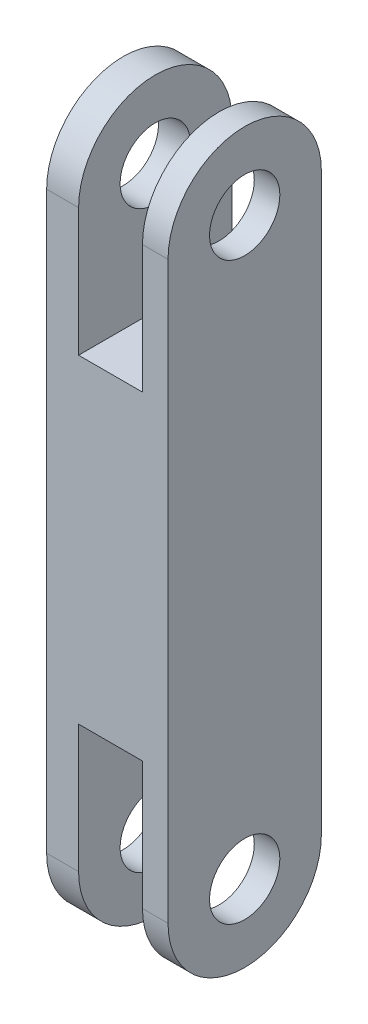
ISO-10303-21;
HEADER;
FILE_DESCRIPTION(('STEP AP214'),'2;1');
FILE_NAME('part.step','',(''),(''),'','','');
FILE_SCHEMA(('AUTOMOTIVE_DESIGN { 1 0 10303 214 1 1 1 1 }'));
ENDSEC;
DATA;
#1=APPLICATION_CONTEXT('core data for automotive mechanical design processes');
#2=APPLICATION_PROTOCOL_DEFINITION('international standard','automotive_design',2000,#1);
#3=PRODUCT_CONTEXT('',#1,'mechanical');
#4=PRODUCT('Part','Part','',(#3));
#5=PRODUCT_RELATED_PRODUCT_CATEGORY('part','',(#4));
#6=PRODUCT_DEFINITION_FORMATION('','',#4);
#7=PRODUCT_DEFINITION_CONTEXT('part definition',#1,'design');
#8=PRODUCT_DEFINITION('design','',#6,#7);
#9=PRODUCT_DEFINITION_SHAPE('','',#8);
#10=(LENGTH_UNIT() NAMED_UNIT(*) SI_UNIT(.MILLI.,.METRE.));
#11=(NAMED_UNIT(*) PLANE_ANGLE_UNIT() SI_UNIT($,.RADIAN.));
#12=(NAMED_UNIT(*) SI_UNIT($,.STERADIAN.) SOLID_ANGLE_UNIT());
#13=UNCERTAINTY_MEASURE_WITH_UNIT(LENGTH_MEASURE(1.E-05),#10,'distance_accuracy_value','');
#14=(GEOMETRIC_REPRESENTATION_CONTEXT(3) GLOBAL_UNCERTAINTY_ASSIGNED_CONTEXT((#13)) GLOBAL_UNIT_ASSIGNED_CONTEXT((#10,
#11,#12)) REPRESENTATION_CONTEXT('',''));
#15=CARTESIAN_POINT('',(0.,0.,0.));
#16=DIRECTION('',(0.,0.,1.));
#17=DIRECTION('',(1.,0.,0.));
#18=AXIS2_PLACEMENT_3D('',#15,#16,#17);
#19=CARTESIAN_POINT('',(0.,0.,0.));
#20=DIRECTION('',(1.,0.,0.));
#21=DIRECTION('',(0.,0.,-1.));
#22=AXIS2_PLACEMENT_3D('',#19,#20,#21);
#23=PLANE('',#22);
#24=CARTESIAN_POINT('',(0.,45.,0.));
#25=DIRECTION('',(1.,0.,0.));
#26=DIRECTION('',(0.,0.,-1.));
#27=AXIS2_PLACEMENT_3D('',#24,#25,#26);
#28=CIRCLE('',#27,2.75000000000001);
#29=CARTESIAN_POINT('',(0.,45.,-2.75000000000001));
#30=VERTEX_POINT('',#29);
#31=EDGE_CURVE('E181',#30,#30,#28,.T.);
#32=ORIENTED_EDGE('',*,*,#31,.T.);
#33=EDGE_LOOP('',(#32));
#34=FACE_BOUND('',#33,.T.);
#35=DIRECTION('',(0.,0.,-1.));
#36=VECTOR('',#35,1.);
#37=CARTESIAN_POINT('',(0.,35.,6.));
#38=LINE('',#37,#36);
#39=CARTESIAN_POINT('',(0.,35.,6.));
#40=VERTEX_POINT('',#39);
#41=CARTESIAN_POINT('',(0.,35.,-6.));
#42=VERTEX_POINT('',#41);
#43=EDGE_CURVE('E155',#40,#42,#38,.T.);
#44=ORIENTED_EDGE('',*,*,#43,.F.);
#45=DIRECTION('',(0.,-1.,0.));
#46=VECTOR('',#45,1.);
#47=CARTESIAN_POINT('',(0.,0.,6.));
#48=LINE('',#47,#46);
#49=CARTESIAN_POINT('',(0.,45.,6.));
#50=VERTEX_POINT('',#49);
#51=EDGE_CURVE('E198',#50,#40,#48,.T.);
#52=ORIENTED_EDGE('',*,*,#51,.F.);
#53=CARTESIAN_POINT('',(0.,45.,0.));
#54=DIRECTION('',(1.,0.,0.));
#55=DIRECTION('',(0.,0.,-1.));
#56=AXIS2_PLACEMENT_3D('',#53,#54,#55);
#57=CIRCLE('',#56,6.);
#58=CARTESIAN_POINT('',(0.,45.,-6.));
#59=VERTEX_POINT('',#58);
#60=EDGE_CURVE('E209',#59,#50,#57,.T.);
#61=ORIENTED_EDGE('',*,*,#60,.F.);
#62=DIRECTION('',(0.,1.,0.));
#63=VECTOR('',#62,1.);
#64=CARTESIAN_POINT('',(0.,0.,-6.));
#65=LINE('',#64,#63);
#66=EDGE_CURVE('E54',#42,#59,#65,.T.);
#67=ORIENTED_EDGE('',*,*,#66,.F.);
#68=EDGE_LOOP('',(#44,#52,#61,#67));
#69=FACE_BOUND('',#68,.T.);
#70=ADVANCED_FACE('F39',(#34,#69),#23,.F.);
#71=CARTESIAN_POINT('',(0.,0.,0.));
#72=DIRECTION('',(1.,0.,0.));
#73=DIRECTION('',(0.,0.,-1.));
#74=AXIS2_PLACEMENT_3D('',#71,#72,#73);
#75=CIRCLE('',#74,2.75);
#76=CARTESIAN_POINT('',(0.,0.,-2.75));
#77=VERTEX_POINT('',#76);
#78=EDGE_CURVE('E185',#77,#77,#75,.T.);
#79=ORIENTED_EDGE('',*,*,#78,.T.);
#80=EDGE_LOOP('',(#79));
#81=FACE_BOUND('',#80,.T.);
#82=DIRECTION('',(0.,0.,1.));
#83=VECTOR('',#82,1.);
#84=CARTESIAN_POINT('',(0.,10.,6.));
#85=LINE('',#84,#83);
#86=CARTESIAN_POINT('',(0.,10.,-6.));
#87=VERTEX_POINT('',#86);
#88=CARTESIAN_POINT('',(0.,10.,6.));
#89=VERTEX_POINT('',#88);
#90=EDGE_CURVE('E62',#87,#89,#85,.T.);
#91=ORIENTED_EDGE('',*,*,#90,.F.);
#92=CARTESIAN_POINT('',(0.,0.,-6.));
#93=VERTEX_POINT('',#92);
#94=EDGE_CURVE('E207',#93,#87,#65,.T.);
#95=ORIENTED_EDGE('',*,*,#94,.F.);
#96=CARTESIAN_POINT('',(0.,0.,0.));
#97=DIRECTION('',(1.,0.,0.));
#98=DIRECTION('',(0.,0.,-1.));
#99=AXIS2_PLACEMENT_3D('',#96,#97,#98);
#100=CIRCLE('',#99,6.);
#101=CARTESIAN_POINT('',(0.,0.,6.));
#102=VERTEX_POINT('',#101);
#103=EDGE_CURVE('E191',#102,#93,#100,.T.);
#104=ORIENTED_EDGE('',*,*,#103,.F.);
#105=EDGE_CURVE('E211',#89,#102,#48,.T.);
#106=ORIENTED_EDGE('',*,*,#105,.F.);
#107=EDGE_LOOP('',(#91,#95,#104,#106));
#108=FACE_BOUND('',#107,.T.);
#109=ADVANCED_FACE('F260',(#81,#108),#23,.F.);
#110=CARTESIAN_POINT('',(2.,0.,0.));
#111=DIRECTION('',(1.,0.,0.));
#112=DIRECTION('',(0.,0.,-1.));
#113=AXIS2_PLACEMENT_3D('',#110,#111,#112);
#114=PLANE('',#113);
#115=CARTESIAN_POINT('',(2.,0.,0.));
#116=DIRECTION('',(1.,0.,0.));
#117=DIRECTION('',(0.,0.,-1.));
#118=AXIS2_PLACEMENT_3D('',#115,#116,#117);
#119=CIRCLE('',#118,2.75);
#120=CARTESIAN_POINT('',(2.,0.,-2.75));
#121=VERTEX_POINT('',#120);
#122=EDGE_CURVE('E188',#121,#121,#119,.T.);
#123=ORIENTED_EDGE('',*,*,#122,.F.);
#124=EDGE_LOOP('',(#123));
#125=FACE_BOUND('',#124,.T.);
#126=CARTESIAN_POINT('',(2.,0.,0.));
#127=DIRECTION('',(1.,0.,0.));
#128=DIRECTION('',(0.,0.,-1.));
#129=AXIS2_PLACEMENT_3D('',#126,#127,#128);
#130=CIRCLE('',#129,6.);
#131=CARTESIAN_POINT('',(2.,0.,6.));
#132=VERTEX_POINT('',#131);
#133=CARTESIAN_POINT('',(2.,0.,-6.));
#134=VERTEX_POINT('',#133);
#135=EDGE_CURVE('E194',#132,#134,#130,.T.);
#136=ORIENTED_EDGE('',*,*,#135,.T.);
#137=DIRECTION('',(0.,1.,0.));
#138=VECTOR('',#137,1.);
#139=CARTESIAN_POINT('',(2.,0.,-6.));
#140=LINE('',#139,#138);
#141=CARTESIAN_POINT('',(2.,45.,-6.));
#142=VERTEX_POINT('',#141);
#143=EDGE_CURVE('E197',#134,#142,#140,.T.);
#144=ORIENTED_EDGE('',*,*,#143,.T.);
#145=CARTESIAN_POINT('',(2.,45.,0.));
#146=DIRECTION('',(1.,0.,0.));
#147=DIRECTION('',(0.,0.,-1.));
#148=AXIS2_PLACEMENT_3D('',#145,#146,#147);
#149=CIRCLE('',#148,6.);
#150=CARTESIAN_POINT('',(2.,45.,6.));
#151=VERTEX_POINT('',#150);
#152=EDGE_CURVE('E200',#142,#151,#149,.T.);
#153=ORIENTED_EDGE('',*,*,#152,.T.);
#154=DIRECTION('',(0.,-1.,0.));
#155=VECTOR('',#154,1.);
#156=CARTESIAN_POINT('',(2.,0.,6.));
#157=LINE('',#156,#155);
#158=EDGE_CURVE('E202',#151,#132,#157,.T.);
#159=ORIENTED_EDGE('',*,*,#158,.T.);
#160=EDGE_LOOP('',(#136,#144,#153,#159));
#161=FACE_BOUND('',#160,.T.);
#162=CARTESIAN_POINT('',(2.,45.,0.));
#163=DIRECTION('',(1.,0.,0.));
#164=DIRECTION('',(0.,0.,-1.));
#165=AXIS2_PLACEMENT_3D('',#162,#163,#164);
#166=CIRCLE('',#165,2.75000000000001);
#167=CARTESIAN_POINT('',(2.,45.,-2.75000000000001));
#168=VERTEX_POINT('',#167);
#169=EDGE_CURVE('E182',#168,#168,#166,.T.);
#170=ORIENTED_EDGE('',*,*,#169,.F.);
#171=EDGE_LOOP('',(#170));
#172=FACE_BOUND('',#171,.T.);
#173=ADVANCED_FACE('F262',(#125,#161,#172),#114,.T.);
#174=CARTESIAN_POINT('',(2.,0.,0.));
#175=DIRECTION('',(-1.,0.,0.));
#176=DIRECTION('',(0.,0.,1.));
#177=AXIS2_PLACEMENT_3D('',#174,#175,#176);
#178=CYLINDRICAL_SURFACE('',#177,6.);
#179=ORIENTED_EDGE('',*,*,#103,.T.);
#180=DIRECTION('',(-1.,0.,0.));
#181=VECTOR('',#180,1.);
#182=CARTESIAN_POINT('',(2.,0.,-6.));
#183=LINE('',#182,#181);
#184=EDGE_CURVE('E11',#134,#93,#183,.T.);
#185=ORIENTED_EDGE('',*,*,#184,.F.);
#186=ORIENTED_EDGE('',*,*,#135,.F.);
#187=DIRECTION('',(-1.,0.,0.));
#188=VECTOR('',#187,1.);
#189=CARTESIAN_POINT('',(2.,0.,6.));
#190=LINE('',#189,#188);
#191=EDGE_CURVE('E204',#132,#102,#190,.T.);
#192=ORIENTED_EDGE('',*,*,#191,.T.);
#193=EDGE_LOOP('',(#179,#185,#186,#192));
#194=FACE_BOUND('',#193,.T.);
#195=ADVANCED_FACE('F41',(#194),#178,.T.);
#196=CARTESIAN_POINT('',(2.,0.,-6.));
#197=DIRECTION('',(0.,0.,1.));
#198=DIRECTION('',(0.,-1.,0.));
#199=AXIS2_PLACEMENT_3D('',#196,#197,#198);
#200=PLANE('',#199);
#201=ORIENTED_EDGE('',*,*,#94,.T.);
#202=DIRECTION('',(1.,0.,0.));
#203=VECTOR('',#202,1.);
#204=CARTESIAN_POINT('',(-5.,10.,-6.));
#205=LINE('',#204,#203);
#206=CARTESIAN_POINT('',(-5.,10.,-6.));
#207=VERTEX_POINT('',#206);
#208=EDGE_CURVE('E176',#207,#87,#205,.T.);
#209=ORIENTED_EDGE('',*,*,#208,.F.);
#210=DIRECTION('',(0.,-1.,0.));
#211=VECTOR('',#210,1.);
#212=CARTESIAN_POINT('',(-5.,45.,-6.));
#213=LINE('',#212,#211);
#214=CARTESIAN_POINT('',(-5.,0.,-6.));
#215=VERTEX_POINT('',#214);
#216=EDGE_CURVE('E252',#207,#215,#213,.T.);
#217=ORIENTED_EDGE('',*,*,#216,.T.);
#218=DIRECTION('',(1.,0.,0.));
#219=VECTOR('',#218,1.);
#220=CARTESIAN_POINT('',(-7.5,0.,-6.));
#221=LINE('',#220,#219);
#222=CARTESIAN_POINT('',(-7.5,0.,-6.));
#223=VERTEX_POINT('',#222);
#224=EDGE_CURVE('E136',#223,#215,#221,.T.);
#225=ORIENTED_EDGE('',*,*,#224,.F.);
#226=DIRECTION('',(0.,-1.,0.));
#227=VECTOR('',#226,1.);
#228=CARTESIAN_POINT('',(-7.5,45.,-6.));
#229=LINE('',#228,#227);
#230=CARTESIAN_POINT('',(-7.5,45.,-6.));
#231=VERTEX_POINT('',#230);
#232=EDGE_CURVE('E128',#231,#223,#229,.T.);
#233=ORIENTED_EDGE('',*,*,#232,.F.);
#234=DIRECTION('',(1.,0.,0.));
#235=VECTOR('',#234,1.);
#236=CARTESIAN_POINT('',(-7.5,45.,-6.));
#237=LINE('',#236,#235);
#238=CARTESIAN_POINT('',(-5.,45.,-6.));
#239=VERTEX_POINT('',#238);
#240=EDGE_CURVE('E133',#231,#239,#237,.T.);
#241=ORIENTED_EDGE('',*,*,#240,.T.);
#242=CARTESIAN_POINT('',(-5.,35.,-6.));
#243=VERTEX_POINT('',#242);
#244=EDGE_CURVE('E238',#239,#243,#213,.T.);
#245=ORIENTED_EDGE('',*,*,#244,.T.);
#246=DIRECTION('',(1.,0.,0.));
#247=VECTOR('',#246,1.);
#248=CARTESIAN_POINT('',(-5.,35.,-6.));
#249=LINE('',#248,#247);
#250=EDGE_CURVE('E179',#243,#42,#249,.T.);
#251=ORIENTED_EDGE('',*,*,#250,.T.);
#252=ORIENTED_EDGE('',*,*,#66,.T.);
#253=DIRECTION('',(-1.,0.,0.));
#254=VECTOR('',#253,1.);
#255=CARTESIAN_POINT('',(2.,45.,-6.));
#256=LINE('',#255,#254);
#257=EDGE_CURVE('E47',#142,#59,#256,.T.);
#258=ORIENTED_EDGE('',*,*,#257,.F.);
#259=ORIENTED_EDGE('',*,*,#143,.F.);
#260=ORIENTED_EDGE('',*,*,#184,.T.);
#261=EDGE_LOOP('',(#201,#209,#217,#225,#233,#241,#245,#251,#252,#258,#259,#260));
#262=FACE_BOUND('',#261,.T.);
#263=ADVANCED_FACE('F130',(#262),#200,.F.);
#264=CARTESIAN_POINT('',(2.,45.,0.));
#265=DIRECTION('',(-1.,0.,0.));
#266=DIRECTION('',(0.,0.,1.));
#267=AXIS2_PLACEMENT_3D('',#264,#265,#266);
#268=CYLINDRICAL_SURFACE('',#267,6.);
#269=ORIENTED_EDGE('',*,*,#60,.T.);
#270=DIRECTION('',(-1.,0.,0.));
#271=VECTOR('',#270,1.);
#272=CARTESIAN_POINT('',(2.,45.,6.));
#273=LINE('',#272,#271);
#274=EDGE_CURVE('E216',#151,#50,#273,.T.);
#275=ORIENTED_EDGE('',*,*,#274,.F.);
#276=ORIENTED_EDGE('',*,*,#152,.F.);
#277=ORIENTED_EDGE('',*,*,#257,.T.);
#278=EDGE_LOOP('',(#269,#275,#276,#277));
#279=FACE_BOUND('',#278,.T.);
#280=ADVANCED_FACE('F222',(#279),#268,.T.);
#281=CARTESIAN_POINT('',(2.,0.,6.));
#282=DIRECTION('',(0.,0.,-1.));
#283=DIRECTION('',(0.,1.,0.));
#284=AXIS2_PLACEMENT_3D('',#281,#282,#283);
#285=PLANE('',#284);
#286=ORIENTED_EDGE('',*,*,#51,.T.);
#287=DIRECTION('',(1.,0.,0.));
#288=VECTOR('',#287,1.);
#289=CARTESIAN_POINT('',(-5.,35.,6.));
#290=LINE('',#289,#288);
#291=CARTESIAN_POINT('',(-5.,35.,6.));
#292=VERTEX_POINT('',#291);
#293=EDGE_CURVE('E168',#292,#40,#290,.T.);
#294=ORIENTED_EDGE('',*,*,#293,.F.);
#295=DIRECTION('',(0.,1.,0.));
#296=VECTOR('',#295,1.);
#297=CARTESIAN_POINT('',(-5.,45.,6.));
#298=LINE('',#297,#296);
#299=CARTESIAN_POINT('',(-5.,45.,6.));
#300=VERTEX_POINT('',#299);
#301=EDGE_CURVE('E233',#292,#300,#298,.T.);
#302=ORIENTED_EDGE('',*,*,#301,.T.);
#303=DIRECTION('',(1.,0.,0.));
#304=VECTOR('',#303,1.);
#305=CARTESIAN_POINT('',(-7.5,45.,6.));
#306=LINE('',#305,#304);
#307=CARTESIAN_POINT('',(-7.5,45.,6.));
#308=VERTEX_POINT('',#307);
#309=EDGE_CURVE('E242',#308,#300,#306,.T.);
#310=ORIENTED_EDGE('',*,*,#309,.F.);
#311=DIRECTION('',(0.,1.,0.));
#312=VECTOR('',#311,1.);
#313=CARTESIAN_POINT('',(-7.5,45.,6.));
#314=LINE('',#313,#312);
#315=CARTESIAN_POINT('',(-7.5,0.,6.));
#316=VERTEX_POINT('',#315);
#317=EDGE_CURVE('E146',#316,#308,#314,.T.);
#318=ORIENTED_EDGE('',*,*,#317,.F.);
#319=DIRECTION('',(1.,0.,0.));
#320=VECTOR('',#319,1.);
#321=CARTESIAN_POINT('',(-7.5,0.,6.));
#322=LINE('',#321,#320);
#323=CARTESIAN_POINT('',(-5.,0.,6.));
#324=VERTEX_POINT('',#323);
#325=EDGE_CURVE('E159',#316,#324,#322,.T.);
#326=ORIENTED_EDGE('',*,*,#325,.T.);
#327=CARTESIAN_POINT('',(-5.,10.,6.));
#328=VERTEX_POINT('',#327);
#329=EDGE_CURVE('E150',#324,#328,#298,.T.);
#330=ORIENTED_EDGE('',*,*,#329,.T.);
#331=DIRECTION('',(1.,0.,0.));
#332=VECTOR('',#331,1.);
#333=CARTESIAN_POINT('',(-5.,10.,6.));
#334=LINE('',#333,#332);
#335=EDGE_CURVE('E173',#328,#89,#334,.T.);
#336=ORIENTED_EDGE('',*,*,#335,.T.);
#337=ORIENTED_EDGE('',*,*,#105,.T.);
#338=ORIENTED_EDGE('',*,*,#191,.F.);
#339=ORIENTED_EDGE('',*,*,#158,.F.);
#340=ORIENTED_EDGE('',*,*,#274,.T.);
#341=EDGE_LOOP('',(#286,#294,#302,#310,#318,#326,#330,#336,#337,#338,#339,#340));
#342=FACE_BOUND('',#341,.T.);
#343=ADVANCED_FACE('F226',(#342),#285,.F.);
#344=CARTESIAN_POINT('',(2.,0.,0.));
#345=DIRECTION('',(-1.,0.,0.));
#346=DIRECTION('',(0.,0.,1.));
#347=AXIS2_PLACEMENT_3D('',#344,#345,#346);
#348=CYLINDRICAL_SURFACE('',#347,2.75);
#349=ORIENTED_EDGE('',*,*,#122,.T.);
#350=EDGE_LOOP('',(#349));
#351=FACE_BOUND('',#350,.T.);
#352=ORIENTED_EDGE('',*,*,#78,.F.);
#353=EDGE_LOOP('',(#352));
#354=FACE_BOUND('',#353,.T.);
#355=ADVANCED_FACE('F272',(#351,#354),#348,.F.);
#356=CARTESIAN_POINT('',(2.,45.,0.));
#357=DIRECTION('',(-1.,0.,0.));
#358=DIRECTION('',(0.,0.,1.));
#359=AXIS2_PLACEMENT_3D('',#356,#357,#358);
#360=CYLINDRICAL_SURFACE('',#359,2.75000000000001);
#361=ORIENTED_EDGE('',*,*,#169,.T.);
#362=EDGE_LOOP('',(#361));
#363=FACE_BOUND('',#362,.T.);
#364=ORIENTED_EDGE('',*,*,#31,.F.);
#365=EDGE_LOOP('',(#364));
#366=FACE_BOUND('',#365,.T.);
#367=ADVANCED_FACE('F269',(#363,#366),#360,.F.);
#368=CARTESIAN_POINT('',(-5.,35.,6.));
#369=DIRECTION('',(0.,-1.,0.));
#370=DIRECTION('',(0.,0.,-1.));
#371=AXIS2_PLACEMENT_3D('',#368,#369,#370);
#372=PLANE('',#371);
#373=ORIENTED_EDGE('',*,*,#43,.T.);
#374=ORIENTED_EDGE('',*,*,#250,.F.);
#375=DIRECTION('',(0.,0.,-1.));
#376=VECTOR('',#375,1.);
#377=CARTESIAN_POINT('',(-5.,35.,6.));
#378=LINE('',#377,#376);
#379=EDGE_CURVE('E163',#292,#243,#378,.T.);
#380=ORIENTED_EDGE('',*,*,#379,.F.);
#381=ORIENTED_EDGE('',*,*,#293,.T.);
#382=EDGE_LOOP('',(#373,#374,#380,#381));
#383=FACE_BOUND('',#382,.T.);
#384=ADVANCED_FACE('F230',(#383),#372,.F.);
#385=CARTESIAN_POINT('',(-5.,10.,6.));
#386=DIRECTION('',(0.,1.,0.));
#387=DIRECTION('',(0.,0.,1.));
#388=AXIS2_PLACEMENT_3D('',#385,#386,#387);
#389=PLANE('',#388);
#390=ORIENTED_EDGE('',*,*,#90,.T.);
#391=ORIENTED_EDGE('',*,*,#335,.F.);
#392=DIRECTION('',(0.,0.,1.));
#393=VECTOR('',#392,1.);
#394=CARTESIAN_POINT('',(-5.,10.,6.));
#395=LINE('',#394,#393);
#396=EDGE_CURVE('E166',#207,#328,#395,.T.);
#397=ORIENTED_EDGE('',*,*,#396,.F.);
#398=ORIENTED_EDGE('',*,*,#208,.T.);
#399=EDGE_LOOP('',(#390,#391,#397,#398));
#400=FACE_BOUND('',#399,.T.);
#401=ADVANCED_FACE('F254',(#400),#389,.F.);
#402=CARTESIAN_POINT('',(-5.,45.,0.));
#403=DIRECTION('',(-1.,0.,0.));
#404=DIRECTION('',(0.,0.,1.));
#405=AXIS2_PLACEMENT_3D('',#402,#403,#404);
#406=PLANE('',#405);
#407=CARTESIAN_POINT('',(-5.,45.,0.));
#408=DIRECTION('',(-1.,0.,0.));
#409=DIRECTION('',(0.,0.,1.));
#410=AXIS2_PLACEMENT_3D('',#407,#408,#409);
#411=CIRCLE('',#410,2.75000000000001);
#412=CARTESIAN_POINT('',(-5.,45.,2.75000000000001));
#413=VERTEX_POINT('',#412);
#414=EDGE_CURVE('E431',#413,#413,#411,.T.);
#415=ORIENTED_EDGE('',*,*,#414,.T.);
#416=EDGE_LOOP('',(#415));
#417=FACE_BOUND('',#416,.T.);
#418=ORIENTED_EDGE('',*,*,#301,.F.);
#419=ORIENTED_EDGE('',*,*,#379,.T.);
#420=ORIENTED_EDGE('',*,*,#244,.F.);
#421=CARTESIAN_POINT('',(-5.,45.,0.));
#422=DIRECTION('',(-1.,0.,0.));
#423=DIRECTION('',(0.,0.,1.));
#424=AXIS2_PLACEMENT_3D('',#421,#422,#423);
#425=CIRCLE('',#424,6.);
#426=EDGE_CURVE('E154',#300,#239,#425,.T.);
#427=ORIENTED_EDGE('',*,*,#426,.F.);
#428=EDGE_LOOP('',(#418,#419,#420,#427));
#429=FACE_BOUND('',#428,.T.);
#430=ADVANCED_FACE('F234',(#417,#429),#406,.F.);
#431=CARTESIAN_POINT('',(-5.,0.,0.));
#432=DIRECTION('',(-1.,0.,0.));
#433=DIRECTION('',(0.,0.,1.));
#434=AXIS2_PLACEMENT_3D('',#431,#432,#433);
#435=CIRCLE('',#434,2.75);
#436=CARTESIAN_POINT('',(-5.,0.,2.75));
#437=VERTEX_POINT('',#436);
#438=EDGE_CURVE('E429',#437,#437,#435,.T.);
#439=ORIENTED_EDGE('',*,*,#438,.T.);
#440=EDGE_LOOP('',(#439));
#441=FACE_BOUND('',#440,.T.);
#442=ORIENTED_EDGE('',*,*,#216,.F.);
#443=ORIENTED_EDGE('',*,*,#396,.T.);
#444=ORIENTED_EDGE('',*,*,#329,.F.);
#445=CARTESIAN_POINT('',(-5.,0.,0.));
#446=DIRECTION('',(-1.,0.,0.));
#447=DIRECTION('',(0.,0.,1.));
#448=AXIS2_PLACEMENT_3D('',#445,#446,#447);
#449=CIRCLE('',#448,6.);
#450=EDGE_CURVE('E235',#215,#324,#449,.T.);
#451=ORIENTED_EDGE('',*,*,#450,.F.);
#452=EDGE_LOOP('',(#442,#443,#444,#451));
#453=FACE_BOUND('',#452,.T.);
#454=ADVANCED_FACE('F250',(#441,#453),#406,.F.);
#455=CARTESIAN_POINT('',(-7.5,45.,0.));
#456=DIRECTION('',(-1.,0.,0.));
#457=DIRECTION('',(0.,0.,1.));
#458=AXIS2_PLACEMENT_3D('',#455,#456,#457);
#459=PLANE('',#458);
#460=CARTESIAN_POINT('',(-7.5,45.,0.));
#461=DIRECTION('',(-1.,0.,0.));
#462=DIRECTION('',(0.,0.,1.));
#463=AXIS2_PLACEMENT_3D('',#460,#461,#462);
#464=CIRCLE('',#463,2.75000000000001);
#465=CARTESIAN_POINT('',(-7.5,45.,2.75000000000001));
#466=VERTEX_POINT('',#465);
#467=EDGE_CURVE('E434',#466,#466,#464,.T.);
#468=ORIENTED_EDGE('',*,*,#467,.F.);
#469=EDGE_LOOP('',(#468));
#470=FACE_BOUND('',#469,.T.);
#471=CARTESIAN_POINT('',(-7.5,45.,0.));
#472=DIRECTION('',(-1.,0.,0.));
#473=DIRECTION('',(0.,0.,1.));
#474=AXIS2_PLACEMENT_3D('',#471,#472,#473);
#475=CIRCLE('',#474,6.);
#476=EDGE_CURVE('E140',#308,#231,#475,.T.);
#477=ORIENTED_EDGE('',*,*,#476,.T.);
#478=ORIENTED_EDGE('',*,*,#232,.T.);
#479=CARTESIAN_POINT('',(-7.5,0.,0.));
#480=DIRECTION('',(-1.,0.,0.));
#481=DIRECTION('',(0.,0.,1.));
#482=AXIS2_PLACEMENT_3D('',#479,#480,#481);
#483=CIRCLE('',#482,6.);
#484=EDGE_CURVE('E139',#223,#316,#483,.T.);
#485=ORIENTED_EDGE('',*,*,#484,.T.);
#486=ORIENTED_EDGE('',*,*,#317,.T.);
#487=EDGE_LOOP('',(#477,#478,#485,#486));
#488=FACE_BOUND('',#487,.T.);
#489=CARTESIAN_POINT('',(-7.5,0.,0.));
#490=DIRECTION('',(-1.,0.,0.));
#491=DIRECTION('',(0.,0.,1.));
#492=AXIS2_PLACEMENT_3D('',#489,#490,#491);
#493=CIRCLE('',#492,2.75);
#494=CARTESIAN_POINT('',(-7.5,0.,2.75));
#495=VERTEX_POINT('',#494);
#496=EDGE_CURVE('E426',#495,#495,#493,.T.);
#497=ORIENTED_EDGE('',*,*,#496,.F.);
#498=EDGE_LOOP('',(#497));
#499=FACE_BOUND('',#498,.T.);
#500=ADVANCED_FACE('F143',(#470,#488,#499),#459,.T.);
#501=CARTESIAN_POINT('',(-7.5,45.,0.));
#502=DIRECTION('',(1.,0.,0.));
#503=DIRECTION('',(0.,0.,-1.));
#504=AXIS2_PLACEMENT_3D('',#501,#502,#503);
#505=CYLINDRICAL_SURFACE('',#504,6.);
#506=ORIENTED_EDGE('',*,*,#426,.T.);
#507=ORIENTED_EDGE('',*,*,#240,.F.);
#508=ORIENTED_EDGE('',*,*,#476,.F.);
#509=ORIENTED_EDGE('',*,*,#309,.T.);
#510=EDGE_LOOP('',(#506,#507,#508,#509));
#511=FACE_BOUND('',#510,.T.);
#512=ADVANCED_FACE('F152',(#511),#505,.T.);
#513=CARTESIAN_POINT('',(-7.5,0.,0.));
#514=DIRECTION('',(1.,0.,0.));
#515=DIRECTION('',(0.,0.,-1.));
#516=AXIS2_PLACEMENT_3D('',#513,#514,#515);
#517=CYLINDRICAL_SURFACE('',#516,6.);
#518=ORIENTED_EDGE('',*,*,#450,.T.);
#519=ORIENTED_EDGE('',*,*,#325,.F.);
#520=ORIENTED_EDGE('',*,*,#484,.F.);
#521=ORIENTED_EDGE('',*,*,#224,.T.);
#522=EDGE_LOOP('',(#518,#519,#520,#521));
#523=FACE_BOUND('',#522,.T.);
#524=ADVANCED_FACE('F387',(#523),#517,.T.);
#525=CARTESIAN_POINT('',(-7.5,45.,0.));
#526=DIRECTION('',(1.,0.,0.));
#527=DIRECTION('',(0.,0.,-1.));
#528=AXIS2_PLACEMENT_3D('',#525,#526,#527);
#529=CYLINDRICAL_SURFACE('',#528,2.75000000000001);
#530=ORIENTED_EDGE('',*,*,#467,.T.);
#531=EDGE_LOOP('',(#530));
#532=FACE_BOUND('',#531,.T.);
#533=ORIENTED_EDGE('',*,*,#414,.F.);
#534=EDGE_LOOP('',(#533));
#535=FACE_BOUND('',#534,.T.);
#536=ADVANCED_FACE('F395',(#532,#535),#529,.F.);
#537=CARTESIAN_POINT('',(-7.5,0.,0.));
#538=DIRECTION('',(1.,0.,0.));
#539=DIRECTION('',(0.,0.,-1.));
#540=AXIS2_PLACEMENT_3D('',#537,#538,#539);
#541=CYLINDRICAL_SURFACE('',#540,2.75);
#542=ORIENTED_EDGE('',*,*,#496,.T.);
#543=EDGE_LOOP('',(#542));
#544=FACE_BOUND('',#543,.T.);
#545=ORIENTED_EDGE('',*,*,#438,.F.);
#546=EDGE_LOOP('',(#545));
#547=FACE_BOUND('',#546,.T.);
#548=ADVANCED_FACE('F403',(#544,#547),#541,.F.);
#549=CLOSED_SHELL('',(#70,#109,#173,#195,#263,#280,#343,#355,#367,#384,#401,#430,#454,#500,#512,
#524,#536,#548));
#550=MANIFOLD_SOLID_BREP('B2',#549);
#551=ADVANCED_BREP_SHAPE_REPRESENTATION('',(#18,#550),#14);
#552=SHAPE_DEFINITION_REPRESENTATION(#9,#551);
ENDSEC;
END-ISO-10303-21;
